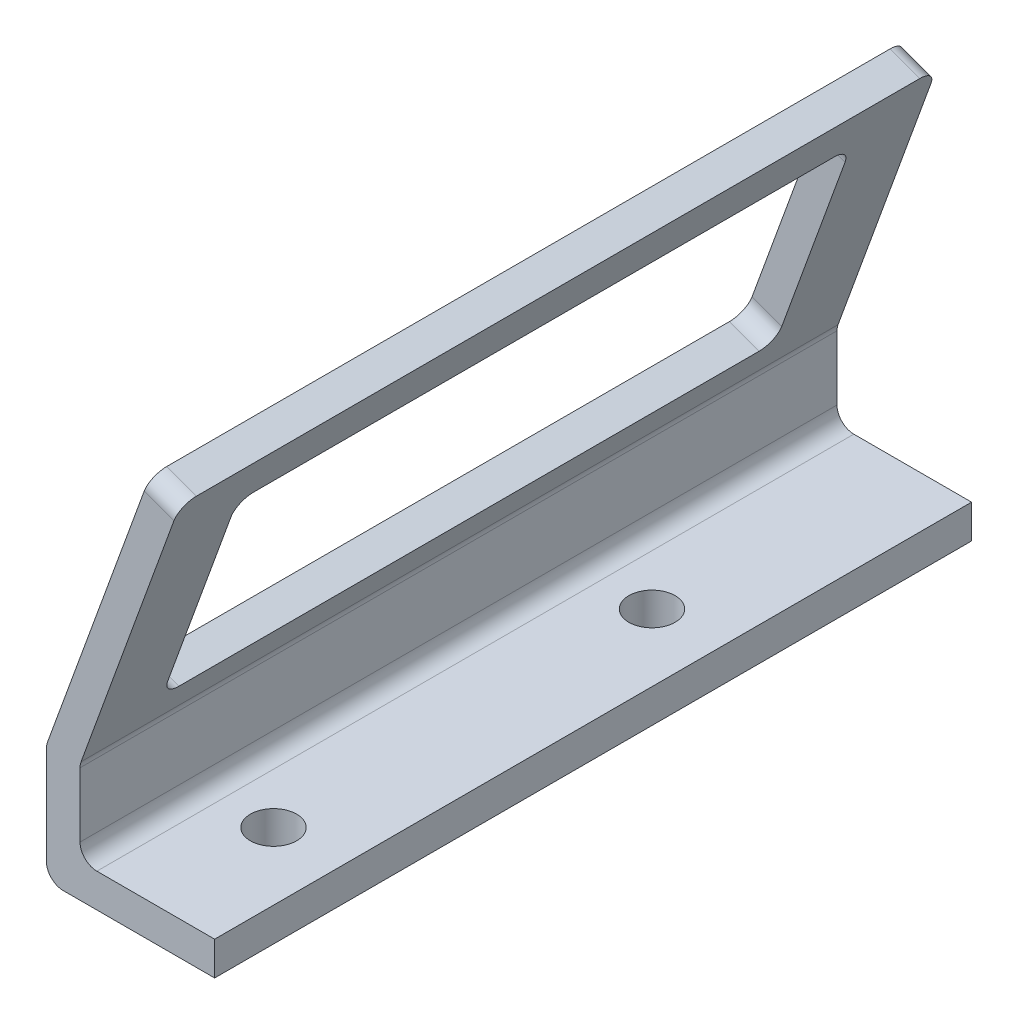
ISO-10303-21;
HEADER;
FILE_DESCRIPTION(('STEP AP214'),'2;1');
FILE_NAME('part.step','',(''),(''),'','','');
FILE_SCHEMA(('AUTOMOTIVE_DESIGN { 1 0 10303 214 1 1 1 1 }'));
ENDSEC;
DATA;
#1=APPLICATION_CONTEXT('core data for automotive mechanical design processes');
#2=APPLICATION_PROTOCOL_DEFINITION('international standard','automotive_design',2000,#1);
#3=PRODUCT_CONTEXT('',#1,'mechanical');
#4=PRODUCT('Part','Part','',(#3));
#5=PRODUCT_RELATED_PRODUCT_CATEGORY('part','',(#4));
#6=PRODUCT_DEFINITION_FORMATION('','',#4);
#7=PRODUCT_DEFINITION_CONTEXT('part definition',#1,'design');
#8=PRODUCT_DEFINITION('design','',#6,#7);
#9=PRODUCT_DEFINITION_SHAPE('','',#8);
#10=(LENGTH_UNIT() NAMED_UNIT(*) SI_UNIT(.MILLI.,.METRE.));
#11=(NAMED_UNIT(*) PLANE_ANGLE_UNIT() SI_UNIT($,.RADIAN.));
#12=(NAMED_UNIT(*) SI_UNIT($,.STERADIAN.) SOLID_ANGLE_UNIT());
#13=UNCERTAINTY_MEASURE_WITH_UNIT(LENGTH_MEASURE(1.E-05),#10,'distance_accuracy_value','');
#14=(GEOMETRIC_REPRESENTATION_CONTEXT(3) GLOBAL_UNCERTAINTY_ASSIGNED_CONTEXT((#13)) GLOBAL_UNIT_ASSIGNED_CONTEXT((#10,
#11,#12)) REPRESENTATION_CONTEXT('',''));
#15=CARTESIAN_POINT('',(0.,0.,0.));
#16=DIRECTION('',(0.,0.,1.));
#17=DIRECTION('',(1.,0.,0.));
#18=AXIS2_PLACEMENT_3D('',#15,#16,#17);
#19=CARTESIAN_POINT('',(-9.15485898747614,3.33209617034567,45.));
#20=DIRECTION('',(0.93969262078591,-0.342020143325663,0.));
#21=DIRECTION('',(0.342020143325663,0.939692620785911,0.));
#22=AXIS2_PLACEMENT_3D('',#19,#20,#21);
#23=PLANE('',#22);
#24=DIRECTION('',(-0.342020143325663,-0.939692620785911,0.));
#25=VECTOR('',#24,1.);
#26=CARTESIAN_POINT('',(-9.15485898747614,3.33209617034568,36.5));
#27=LINE('',#26,#25);
#28=CARTESIAN_POINT('',(3.4506730426822,37.9655107834184,36.5));
#29=VERTEX_POINT('',#28);
#30=CARTESIAN_POINT('',(-4.07377011048238,17.2922731261283,36.5));
#31=VERTEX_POINT('',#30);
#32=EDGE_CURVE('E229',#29,#31,#27,.T.);
#33=ORIENTED_EDGE('',*,*,#32,.F.);
#34=CARTESIAN_POINT('',(3.4506730426822,37.9655107834184,34.5));
#35=DIRECTION('',(0.93969262078591,-0.342020143325663,0.));
#36=DIRECTION('',(0.342020143325663,0.939692620785911,0.));
#37=AXIS2_PLACEMENT_3D('',#34,#35,#36);
#38=CIRCLE('',#37,2.);
#39=CARTESIAN_POINT('',(4.13471332933353,39.8448960249902,34.5));
#40=VERTEX_POINT('',#39);
#41=EDGE_CURVE('E320',#29,#40,#38,.F.);
#42=ORIENTED_EDGE('',*,*,#41,.T.);
#43=DIRECTION('',(0.,0.,1.));
#44=VECTOR('',#43,1.);
#45=CARTESIAN_POINT('',(4.13471332933353,39.8448960249902,45.));
#46=LINE('',#45,#44);
#47=CARTESIAN_POINT('',(4.13471332933353,39.8448960249902,-34.5));
#48=VERTEX_POINT('',#47);
#49=EDGE_CURVE('E356',#48,#40,#46,.T.);
#50=ORIENTED_EDGE('',*,*,#49,.F.);
#51=CARTESIAN_POINT('',(3.4506730426822,37.9655107834184,-34.5));
#52=DIRECTION('',(0.93969262078591,-0.342020143325663,0.));
#53=DIRECTION('',(0.342020143325663,0.939692620785911,0.));
#54=AXIS2_PLACEMENT_3D('',#51,#52,#53);
#55=CIRCLE('',#54,2.);
#56=CARTESIAN_POINT('',(3.45067304268221,37.9655107834184,-36.5));
#57=VERTEX_POINT('',#56);
#58=EDGE_CURVE('E11',#48,#57,#55,.F.);
#59=ORIENTED_EDGE('',*,*,#58,.T.);
#60=DIRECTION('',(0.342020143325663,0.939692620785911,0.));
#61=VECTOR('',#60,1.);
#62=CARTESIAN_POINT('',(-9.15485898747614,3.33209617034567,-36.5));
#63=LINE('',#62,#61);
#64=CARTESIAN_POINT('',(-4.07377011048238,17.2922731261283,-36.5));
#65=VERTEX_POINT('',#64);
#66=EDGE_CURVE('E354',#65,#57,#63,.T.);
#67=ORIENTED_EDGE('',*,*,#66,.F.);
#68=CARTESIAN_POINT('',(-4.07377011048239,17.2922731261283,-34.5));
#69=DIRECTION('',(0.93969262078591,-0.342020143325663,0.));
#70=DIRECTION('',(0.342020143325663,0.939692620785911,0.));
#71=AXIS2_PLACEMENT_3D('',#68,#69,#70);
#72=CIRCLE('',#71,2.);
#73=CARTESIAN_POINT('',(-4.75781039713371,15.4128878845565,-34.5));
#74=VERTEX_POINT('',#73);
#75=EDGE_CURVE('E328',#65,#74,#72,.F.);
#76=ORIENTED_EDGE('',*,*,#75,.T.);
#77=DIRECTION('',(0.,0.,-1.));
#78=VECTOR('',#77,1.);
#79=CARTESIAN_POINT('',(-4.75781039713371,15.4128878845565,45.));
#80=LINE('',#79,#78);
#81=CARTESIAN_POINT('',(-4.75781039713371,15.4128878845565,34.5));
#82=VERTEX_POINT('',#81);
#83=EDGE_CURVE('E360',#82,#74,#80,.T.);
#84=ORIENTED_EDGE('',*,*,#83,.F.);
#85=CARTESIAN_POINT('',(-4.07377011048238,17.2922731261283,34.5));
#86=DIRECTION('',(0.93969262078591,-0.342020143325663,0.));
#87=DIRECTION('',(0.342020143325663,0.939692620785911,0.));
#88=AXIS2_PLACEMENT_3D('',#85,#86,#87);
#89=CIRCLE('',#88,2.);
#90=EDGE_CURVE('E324',#82,#31,#89,.F.);
#91=ORIENTED_EDGE('',*,*,#90,.T.);
#92=EDGE_LOOP('',(#33,#42,#50,#59,#67,#76,#84,#91));
#93=FACE_BOUND('',#92,.T.);
#94=DIRECTION('',(-0.342020143325663,-0.939692620785911,0.));
#95=VECTOR('',#94,1.);
#96=CARTESIAN_POINT('',(-9.15485898747614,3.33209617034567,45.));
#97=LINE('',#96,#95);
#98=CARTESIAN_POINT('',(5.16077375931052,42.6639738873479,45.));
#99=VERTEX_POINT('',#98);
#100=CARTESIAN_POINT('',(-5.87938524157182,12.3313863252344,45.));
#101=VERTEX_POINT('',#100);
#102=EDGE_CURVE('E243',#99,#101,#97,.T.);
#103=ORIENTED_EDGE('',*,*,#102,.T.);
#104=DIRECTION('',(0.,0.,-1.));
#105=VECTOR('',#104,1.);
#106=CARTESIAN_POINT('',(-5.87938524157182,12.3313863252344,45.));
#107=LINE('',#106,#105);
#108=CARTESIAN_POINT('',(-5.87938524157182,12.3313863252344,-45.));
#109=VERTEX_POINT('',#108);
#110=EDGE_CURVE('E278',#101,#109,#107,.T.);
#111=ORIENTED_EDGE('',*,*,#110,.T.);
#112=DIRECTION('',(-0.342020143325663,-0.939692620785911,0.));
#113=VECTOR('',#112,1.);
#114=CARTESIAN_POINT('',(-9.15485898747614,3.33209617034567,-45.));
#115=LINE('',#114,#113);
#116=CARTESIAN_POINT('',(5.16077375931052,42.6639738873479,-45.));
#117=VERTEX_POINT('',#116);
#118=EDGE_CURVE('E225',#117,#109,#115,.T.);
#119=ORIENTED_EDGE('',*,*,#118,.F.);
#120=CARTESIAN_POINT('',(5.16077375931052,42.6639738873479,-43.));
#121=DIRECTION('',(0.93969262078591,-0.342020143325663,0.));
#122=DIRECTION('',(0.342020143325663,0.939692620785911,0.));
#123=AXIS2_PLACEMENT_3D('',#120,#121,#122);
#124=CIRCLE('',#123,2.);
#125=CARTESIAN_POINT('',(5.84481404596184,44.5433591289197,-43.));
#126=VERTEX_POINT('',#125);
#127=EDGE_CURVE('E274',#117,#126,#124,.T.);
#128=ORIENTED_EDGE('',*,*,#127,.T.);
#129=DIRECTION('',(0.,0.,-1.));
#130=VECTOR('',#129,1.);
#131=CARTESIAN_POINT('',(5.84481404596184,44.5433591289197,45.));
#132=LINE('',#131,#130);
#133=CARTESIAN_POINT('',(5.84481404596184,44.5433591289197,43.));
#134=VERTEX_POINT('',#133);
#135=EDGE_CURVE('E246',#134,#126,#132,.T.);
#136=ORIENTED_EDGE('',*,*,#135,.F.);
#137=CARTESIAN_POINT('',(5.16077375931052,42.6639738873479,43.));
#138=DIRECTION('',(0.93969262078591,-0.342020143325663,0.));
#139=DIRECTION('',(0.342020143325663,0.939692620785911,0.));
#140=AXIS2_PLACEMENT_3D('',#137,#138,#139);
#141=CIRCLE('',#140,2.);
#142=EDGE_CURVE('E276',#134,#99,#141,.T.);
#143=ORIENTED_EDGE('',*,*,#142,.T.);
#144=EDGE_LOOP('',(#103,#111,#119,#128,#136,#143));
#145=FACE_BOUND('',#144,.T.);
#146=ADVANCED_FACE('F39',(#93,#145),#23,.T.);
#147=CARTESIAN_POINT('',(14.9996730334379,41.2112629585741,45.));
#148=DIRECTION('',(0.342020143325661,0.939692620785911,0.));
#149=DIRECTION('',(-0.939692620785911,0.342020143325661,0.));
#150=AXIS2_PLACEMENT_3D('',#147,#148,#149);
#151=PLANE('',#150);
#152=DIRECTION('',(0.,0.,-1.));
#153=VECTOR('',#152,1.);
#154=CARTESIAN_POINT('',(2.31272515972385,45.8289343482928,45.));
#155=LINE('',#154,#153);
#156=CARTESIAN_POINT('',(2.31272515972385,45.8289343482928,43.));
#157=VERTEX_POINT('',#156);
#158=CARTESIAN_POINT('',(2.31272515972385,45.8289343482928,-43.));
#159=VERTEX_POINT('',#158);
#160=EDGE_CURVE('E211',#157,#159,#155,.T.);
#161=ORIENTED_EDGE('',*,*,#160,.F.);
#162=DIRECTION('',(0.939692620785911,-0.342020143325661,0.));
#163=VECTOR('',#162,1.);
#164=CARTESIAN_POINT('',(14.9996730334379,41.2112629585741,43.));
#165=LINE('',#164,#163);
#166=EDGE_CURVE('E287',#157,#134,#165,.T.);
#167=ORIENTED_EDGE('',*,*,#166,.T.);
#168=ORIENTED_EDGE('',*,*,#135,.T.);
#169=DIRECTION('',(0.939692620785911,-0.342020143325661,0.));
#170=VECTOR('',#169,1.);
#171=CARTESIAN_POINT('',(2.31272515972385,45.8289343482928,-43.));
#172=LINE('',#171,#170);
#173=EDGE_CURVE('E54',#126,#159,#172,.F.);
#174=ORIENTED_EDGE('',*,*,#173,.T.);
#175=EDGE_LOOP('',(#161,#167,#168,#174));
#176=FACE_BOUND('',#175,.T.);
#177=ADVANCED_FACE('F423',(#176),#151,.T.);
#178=CARTESIAN_POINT('',(-12.6869478737141,4.61767138971873,45.));
#179=DIRECTION('',(-0.939692620785911,0.342020143325662,0.));
#180=DIRECTION('',(-0.342020143325662,-0.939692620785911,0.));
#181=AXIS2_PLACEMENT_3D('',#178,#179,#180);
#182=PLANE('',#181);
#183=DIRECTION('',(0.342020143325662,0.939692620785911,0.));
#184=VECTOR('',#183,1.);
#185=CARTESIAN_POINT('',(0.602624443095541,41.1304712443632,36.5));
#186=LINE('',#185,#184);
#187=CARTESIAN_POINT('',(-7.60585899672036,18.5778483455014,36.5));
#188=VERTEX_POINT('',#187);
#189=CARTESIAN_POINT('',(-0.0814158435557841,39.2510860027914,36.5));
#190=VERTEX_POINT('',#189);
#191=EDGE_CURVE('E346',#188,#190,#186,.T.);
#192=ORIENTED_EDGE('',*,*,#191,.F.);
#193=CARTESIAN_POINT('',(-7.60585899672036,18.5778483455014,34.5));
#194=DIRECTION('',(-0.939692620785911,0.342020143325662,0.));
#195=DIRECTION('',(-0.342020143325662,-0.939692620785911,0.));
#196=AXIS2_PLACEMENT_3D('',#193,#194,#195);
#197=CIRCLE('',#196,2.);
#198=CARTESIAN_POINT('',(-8.28989928337168,16.6984631039296,34.5));
#199=VERTEX_POINT('',#198);
#200=EDGE_CURVE('E322',#188,#199,#197,.F.);
#201=ORIENTED_EDGE('',*,*,#200,.T.);
#202=DIRECTION('',(0.,0.,1.));
#203=VECTOR('',#202,1.);
#204=CARTESIAN_POINT('',(-8.28989928337168,16.6984631039296,-36.5));
#205=LINE('',#204,#203);
#206=CARTESIAN_POINT('',(-8.28989928337168,16.6984631039296,-34.5));
#207=VERTEX_POINT('',#206);
#208=EDGE_CURVE('E364',#207,#199,#205,.T.);
#209=ORIENTED_EDGE('',*,*,#208,.F.);
#210=CARTESIAN_POINT('',(-7.60585899672036,18.5778483455014,-34.5));
#211=DIRECTION('',(-0.939692620785911,0.342020143325662,0.));
#212=DIRECTION('',(-0.342020143325662,-0.939692620785911,0.));
#213=AXIS2_PLACEMENT_3D('',#210,#211,#212);
#214=CIRCLE('',#213,2.);
#215=CARTESIAN_POINT('',(-7.60585899672036,18.5778483455014,-36.5));
#216=VERTEX_POINT('',#215);
#217=EDGE_CURVE('E326',#207,#216,#214,.F.);
#218=ORIENTED_EDGE('',*,*,#217,.T.);
#219=DIRECTION('',(-0.342020143325662,-0.939692620785911,0.));
#220=VECTOR('',#219,1.);
#221=CARTESIAN_POINT('',(0.602624443095542,41.1304712443632,-36.5));
#222=LINE('',#221,#220);
#223=CARTESIAN_POINT('',(-0.0814158435557827,39.2510860027914,-36.5));
#224=VERTEX_POINT('',#223);
#225=EDGE_CURVE('E337',#224,#216,#222,.T.);
#226=ORIENTED_EDGE('',*,*,#225,.F.);
#227=CARTESIAN_POINT('',(-0.0814158435557821,39.2510860027914,-34.5));
#228=DIRECTION('',(-0.939692620785911,0.342020143325662,0.));
#229=DIRECTION('',(-0.342020143325662,-0.939692620785911,0.));
#230=AXIS2_PLACEMENT_3D('',#227,#228,#229);
#231=CIRCLE('',#230,2.);
#232=CARTESIAN_POINT('',(0.602624443095542,41.1304712443632,-34.5));
#233=VERTEX_POINT('',#232);
#234=EDGE_CURVE('E47',#224,#233,#231,.F.);
#235=ORIENTED_EDGE('',*,*,#234,.T.);
#236=DIRECTION('',(0.,0.,-1.));
#237=VECTOR('',#236,1.);
#238=CARTESIAN_POINT('',(0.602624443095542,41.1304712443632,-36.5));
#239=LINE('',#238,#237);
#240=CARTESIAN_POINT('',(0.602624443095541,41.1304712443632,34.5));
#241=VERTEX_POINT('',#240);
#242=EDGE_CURVE('E335',#241,#233,#239,.T.);
#243=ORIENTED_EDGE('',*,*,#242,.F.);
#244=CARTESIAN_POINT('',(-0.0814158435557856,39.2510860027914,34.5));
#245=DIRECTION('',(-0.939692620785911,0.342020143325662,0.));
#246=DIRECTION('',(-0.342020143325662,-0.939692620785911,0.));
#247=AXIS2_PLACEMENT_3D('',#244,#245,#246);
#248=CIRCLE('',#247,2.);
#249=EDGE_CURVE('E318',#241,#190,#248,.F.);
#250=ORIENTED_EDGE('',*,*,#249,.T.);
#251=EDGE_LOOP('',(#192,#201,#209,#218,#226,#235,#243,#250));
#252=FACE_BOUND('',#251,.T.);
#253=DIRECTION('',(0.342020143325662,0.939692620785911,0.));
#254=VECTOR('',#253,1.);
#255=CARTESIAN_POINT('',(-12.6869478737141,4.61767138971873,-45.));
#256=LINE('',#255,#254);
#257=CARTESIAN_POINT('',(-9.87938524157182,12.3313863252344,-45.));
#258=VERTEX_POINT('',#257);
#259=CARTESIAN_POINT('',(1.62868487307252,43.949549106721,-45.));
#260=VERTEX_POINT('',#259);
#261=EDGE_CURVE('E228',#258,#260,#256,.T.);
#262=ORIENTED_EDGE('',*,*,#261,.F.);
#263=DIRECTION('',(0.,0.,-1.));
#264=VECTOR('',#263,1.);
#265=CARTESIAN_POINT('',(-9.87938524157182,12.3313863252344,45.));
#266=LINE('',#265,#264);
#267=CARTESIAN_POINT('',(-9.87938524157182,12.3313863252344,45.));
#268=VERTEX_POINT('',#267);
#269=EDGE_CURVE('E284',#258,#268,#266,.F.);
#270=ORIENTED_EDGE('',*,*,#269,.T.);
#271=DIRECTION('',(0.342020143325662,0.939692620785911,0.));
#272=VECTOR('',#271,1.);
#273=CARTESIAN_POINT('',(-12.6869478737141,4.61767138971873,45.));
#274=LINE('',#273,#272);
#275=CARTESIAN_POINT('',(1.62868487307252,43.949549106721,45.));
#276=VERTEX_POINT('',#275);
#277=EDGE_CURVE('E372',#268,#276,#274,.T.);
#278=ORIENTED_EDGE('',*,*,#277,.T.);
#279=CARTESIAN_POINT('',(1.62868487307253,43.949549106721,43.));
#280=DIRECTION('',(-0.939692620785911,0.342020143325662,0.));
#281=DIRECTION('',(-0.342020143325662,-0.939692620785911,0.));
#282=AXIS2_PLACEMENT_3D('',#279,#280,#281);
#283=CIRCLE('',#282,2.);
#284=EDGE_CURVE('E61',#276,#157,#283,.T.);
#285=ORIENTED_EDGE('',*,*,#284,.T.);
#286=ORIENTED_EDGE('',*,*,#160,.T.);
#287=CARTESIAN_POINT('',(1.62868487307252,43.949549106721,-43.));
#288=DIRECTION('',(-0.939692620785911,0.342020143325662,0.));
#289=DIRECTION('',(-0.342020143325662,-0.939692620785911,0.));
#290=AXIS2_PLACEMENT_3D('',#287,#288,#289);
#291=CIRCLE('',#290,2.);
#292=EDGE_CURVE('E281',#159,#260,#291,.T.);
#293=ORIENTED_EDGE('',*,*,#292,.T.);
#294=EDGE_LOOP('',(#262,#270,#278,#285,#286,#293));
#295=FACE_BOUND('',#294,.T.);
#296=ADVANCED_FACE('F334',(#252,#295),#182,.T.);
#297=CARTESIAN_POINT('',(-10.,0.,45.));
#298=DIRECTION('',(-1.,0.,0.));
#299=DIRECTION('',(0.,0.,1.));
#300=AXIS2_PLACEMENT_3D('',#297,#298,#299);
#301=PLANE('',#300);
#302=DIRECTION('',(0.,1.,0.));
#303=VECTOR('',#302,1.);
#304=CARTESIAN_POINT('',(-10.,0.,-45.));
#305=LINE('',#304,#303);
#306=CARTESIAN_POINT('',(-10.,0.,-45.));
#307=VERTEX_POINT('',#306);
#308=CARTESIAN_POINT('',(-10.,11.6473460385831,-45.));
#309=VERTEX_POINT('',#308);
#310=EDGE_CURVE('E232',#307,#309,#305,.T.);
#311=ORIENTED_EDGE('',*,*,#310,.F.);
#312=DIRECTION('',(0.,0.,-1.));
#313=VECTOR('',#312,1.);
#314=CARTESIAN_POINT('',(-10.,0.,45.));
#315=LINE('',#314,#313);
#316=CARTESIAN_POINT('',(-10.,0.,45.));
#317=VERTEX_POINT('',#316);
#318=EDGE_CURVE('E260',#307,#317,#315,.F.);
#319=ORIENTED_EDGE('',*,*,#318,.T.);
#320=DIRECTION('',(0.,1.,0.));
#321=VECTOR('',#320,1.);
#322=CARTESIAN_POINT('',(-10.,0.,45.));
#323=LINE('',#322,#321);
#324=CARTESIAN_POINT('',(-10.,11.6473460385831,45.));
#325=VERTEX_POINT('',#324);
#326=EDGE_CURVE('E201',#317,#325,#323,.T.);
#327=ORIENTED_EDGE('',*,*,#326,.T.);
#328=DIRECTION('',(0.,0.,-1.));
#329=VECTOR('',#328,1.);
#330=CARTESIAN_POINT('',(-10.,11.6473460385831,45.));
#331=LINE('',#330,#329);
#332=EDGE_CURVE('E257',#325,#309,#331,.T.);
#333=ORIENTED_EDGE('',*,*,#332,.T.);
#334=EDGE_LOOP('',(#311,#319,#327,#333));
#335=FACE_BOUND('',#334,.T.);
#336=ADVANCED_FACE('F377',(#335),#301,.T.);
#337=CARTESIAN_POINT('',(0.,-2.,45.));
#338=DIRECTION('',(0.,1.,0.));
#339=DIRECTION('',(0.,0.,1.));
#340=AXIS2_PLACEMENT_3D('',#337,#338,#339);
#341=PLANE('',#340);
#342=CARTESIAN_POINT('',(2.,-2.,30.));
#343=DIRECTION('',(0.,1.,0.));
#344=DIRECTION('',(0.,0.,1.));
#345=AXIS2_PLACEMENT_3D('',#342,#343,#344);
#346=CIRCLE('',#345,2.75);
#347=CARTESIAN_POINT('',(2.,-2.,32.75));
#348=VERTEX_POINT('',#347);
#349=EDGE_CURVE('E472',#348,#348,#346,.T.);
#350=ORIENTED_EDGE('',*,*,#349,.T.);
#351=EDGE_LOOP('',(#350));
#352=FACE_BOUND('',#351,.T.);
#353=CARTESIAN_POINT('',(2.,-2.,-15.));
#354=DIRECTION('',(0.,1.,0.));
#355=DIRECTION('',(0.,0.,1.));
#356=AXIS2_PLACEMENT_3D('',#353,#354,#355);
#357=CIRCLE('',#356,2.75);
#358=CARTESIAN_POINT('',(2.,-2.,-12.25));
#359=VERTEX_POINT('',#358);
#360=EDGE_CURVE('E473',#359,#359,#357,.T.);
#361=ORIENTED_EDGE('',*,*,#360,.T.);
#362=EDGE_LOOP('',(#361));
#363=FACE_BOUND('',#362,.T.);
#364=DIRECTION('',(1.,0.,0.));
#365=VECTOR('',#364,1.);
#366=CARTESIAN_POINT('',(0.,-2.,45.));
#367=LINE('',#366,#365);
#368=CARTESIAN_POINT('',(-8.,-2.,45.));
#369=VERTEX_POINT('',#368);
#370=CARTESIAN_POINT('',(10.,-2.,45.));
#371=VERTEX_POINT('',#370);
#372=EDGE_CURVE('E189',#369,#371,#367,.T.);
#373=ORIENTED_EDGE('',*,*,#372,.F.);
#374=DIRECTION('',(0.,0.,-1.));
#375=VECTOR('',#374,1.);
#376=CARTESIAN_POINT('',(-8.,-2.,-45.));
#377=LINE('',#376,#375);
#378=CARTESIAN_POINT('',(-8.,-2.,-45.));
#379=VERTEX_POINT('',#378);
#380=EDGE_CURVE('E248',#369,#379,#377,.T.);
#381=ORIENTED_EDGE('',*,*,#380,.T.);
#382=DIRECTION('',(1.,0.,0.));
#383=VECTOR('',#382,1.);
#384=CARTESIAN_POINT('',(0.,-2.,-45.));
#385=LINE('',#384,#383);
#386=CARTESIAN_POINT('',(10.,-2.,-45.));
#387=VERTEX_POINT('',#386);
#388=EDGE_CURVE('E207',#379,#387,#385,.T.);
#389=ORIENTED_EDGE('',*,*,#388,.T.);
#390=DIRECTION('',(0.,0.,-1.));
#391=VECTOR('',#390,1.);
#392=CARTESIAN_POINT('',(10.,-2.,45.));
#393=LINE('',#392,#391);
#394=EDGE_CURVE('E204',#371,#387,#393,.T.);
#395=ORIENTED_EDGE('',*,*,#394,.F.);
#396=EDGE_LOOP('',(#373,#381,#389,#395));
#397=FACE_BOUND('',#396,.T.);
#398=ADVANCED_FACE('F205',(#352,#363,#397),#341,.F.);
#399=CARTESIAN_POINT('',(10.,0.,45.));
#400=DIRECTION('',(1.,0.,0.));
#401=DIRECTION('',(0.,0.,-1.));
#402=AXIS2_PLACEMENT_3D('',#399,#400,#401);
#403=PLANE('',#402);
#404=DIRECTION('',(0.,-1.,0.));
#405=VECTOR('',#404,1.);
#406=CARTESIAN_POINT('',(10.,0.,-45.));
#407=LINE('',#406,#405);
#408=CARTESIAN_POINT('',(10.,2.,-45.));
#409=VERTEX_POINT('',#408);
#410=EDGE_CURVE('E236',#409,#387,#407,.T.);
#411=ORIENTED_EDGE('',*,*,#410,.F.);
#412=DIRECTION('',(0.,0.,-1.));
#413=VECTOR('',#412,1.);
#414=CARTESIAN_POINT('',(10.,2.,45.));
#415=LINE('',#414,#413);
#416=CARTESIAN_POINT('',(10.,2.,45.));
#417=VERTEX_POINT('',#416);
#418=EDGE_CURVE('E212',#417,#409,#415,.T.);
#419=ORIENTED_EDGE('',*,*,#418,.F.);
#420=DIRECTION('',(0.,-1.,0.));
#421=VECTOR('',#420,1.);
#422=CARTESIAN_POINT('',(10.,0.,45.));
#423=LINE('',#422,#421);
#424=EDGE_CURVE('E195',#417,#371,#423,.T.);
#425=ORIENTED_EDGE('',*,*,#424,.T.);
#426=ORIENTED_EDGE('',*,*,#394,.T.);
#427=EDGE_LOOP('',(#411,#419,#425,#426));
#428=FACE_BOUND('',#427,.T.);
#429=ADVANCED_FACE('F215',(#428),#403,.T.);
#430=CARTESIAN_POINT('',(0.,2.,45.));
#431=DIRECTION('',(0.,1.,0.));
#432=DIRECTION('',(0.,0.,1.));
#433=AXIS2_PLACEMENT_3D('',#430,#431,#432);
#434=PLANE('',#433);
#435=CARTESIAN_POINT('',(2.,2.,30.));
#436=DIRECTION('',(0.,1.,0.));
#437=DIRECTION('',(0.,0.,1.));
#438=AXIS2_PLACEMENT_3D('',#435,#436,#437);
#439=CIRCLE('',#438,2.75);
#440=CARTESIAN_POINT('',(2.,2.,32.75));
#441=VERTEX_POINT('',#440);
#442=EDGE_CURVE('E469',#441,#441,#439,.T.);
#443=ORIENTED_EDGE('',*,*,#442,.F.);
#444=EDGE_LOOP('',(#443));
#445=FACE_BOUND('',#444,.T.);
#446=CARTESIAN_POINT('',(2.,2.,-15.));
#447=DIRECTION('',(0.,1.,0.));
#448=DIRECTION('',(0.,0.,1.));
#449=AXIS2_PLACEMENT_3D('',#446,#447,#448);
#450=CIRCLE('',#449,2.75);
#451=CARTESIAN_POINT('',(2.,2.,-12.25));
#452=VERTEX_POINT('',#451);
#453=EDGE_CURVE('E734',#452,#452,#450,.T.);
#454=ORIENTED_EDGE('',*,*,#453,.F.);
#455=EDGE_LOOP('',(#454));
#456=FACE_BOUND('',#455,.T.);
#457=DIRECTION('',(1.,0.,0.));
#458=VECTOR('',#457,1.);
#459=CARTESIAN_POINT('',(0.,2.,-45.));
#460=LINE('',#459,#458);
#461=CARTESIAN_POINT('',(-4.,2.,-45.));
#462=VERTEX_POINT('',#461);
#463=EDGE_CURVE('E238',#462,#409,#460,.T.);
#464=ORIENTED_EDGE('',*,*,#463,.F.);
#465=DIRECTION('',(0.,0.,-1.));
#466=VECTOR('',#465,1.);
#467=CARTESIAN_POINT('',(-4.,2.,45.));
#468=LINE('',#467,#466);
#469=CARTESIAN_POINT('',(-4.,2.,45.));
#470=VERTEX_POINT('',#469);
#471=EDGE_CURVE('E272',#462,#470,#468,.F.);
#472=ORIENTED_EDGE('',*,*,#471,.T.);
#473=DIRECTION('',(1.,0.,0.));
#474=VECTOR('',#473,1.);
#475=CARTESIAN_POINT('',(0.,2.,45.));
#476=LINE('',#475,#474);
#477=EDGE_CURVE('E217',#470,#417,#476,.T.);
#478=ORIENTED_EDGE('',*,*,#477,.T.);
#479=ORIENTED_EDGE('',*,*,#418,.T.);
#480=EDGE_LOOP('',(#464,#472,#478,#479));
#481=FACE_BOUND('',#480,.T.);
#482=ADVANCED_FACE('F410',(#445,#456,#481),#434,.T.);
#483=CARTESIAN_POINT('',(-6.,0.,45.));
#484=DIRECTION('',(-1.,0.,0.));
#485=DIRECTION('',(0.,0.,1.));
#486=AXIS2_PLACEMENT_3D('',#483,#484,#485);
#487=PLANE('',#486);
#488=DIRECTION('',(0.,1.,0.));
#489=VECTOR('',#488,1.);
#490=CARTESIAN_POINT('',(-6.,0.,45.));
#491=LINE('',#490,#489);
#492=CARTESIAN_POINT('',(-6.,4.,45.));
#493=VERTEX_POINT('',#492);
#494=CARTESIAN_POINT('',(-6.,11.6473460385831,45.));
#495=VERTEX_POINT('',#494);
#496=EDGE_CURVE('E219',#493,#495,#491,.T.);
#497=ORIENTED_EDGE('',*,*,#496,.F.);
#498=DIRECTION('',(0.,0.,-1.));
#499=VECTOR('',#498,1.);
#500=CARTESIAN_POINT('',(-6.,4.,45.));
#501=LINE('',#500,#499);
#502=CARTESIAN_POINT('',(-6.,4.,-45.));
#503=VERTEX_POINT('',#502);
#504=EDGE_CURVE('E269',#493,#503,#501,.T.);
#505=ORIENTED_EDGE('',*,*,#504,.T.);
#506=DIRECTION('',(0.,1.,0.));
#507=VECTOR('',#506,1.);
#508=CARTESIAN_POINT('',(-6.,0.,-45.));
#509=LINE('',#508,#507);
#510=CARTESIAN_POINT('',(-6.,11.6473460385831,-45.));
#511=VERTEX_POINT('',#510);
#512=EDGE_CURVE('E240',#503,#511,#509,.T.);
#513=ORIENTED_EDGE('',*,*,#512,.T.);
#514=DIRECTION('',(0.,0.,-1.));
#515=VECTOR('',#514,1.);
#516=CARTESIAN_POINT('',(-6.,11.6473460385831,45.));
#517=LINE('',#516,#515);
#518=EDGE_CURVE('E267',#511,#495,#517,.F.);
#519=ORIENTED_EDGE('',*,*,#518,.T.);
#520=EDGE_LOOP('',(#497,#505,#513,#519));
#521=FACE_BOUND('',#520,.T.);
#522=ADVANCED_FACE('F402',(#521),#487,.F.);
#523=CARTESIAN_POINT('',(0.,0.,45.));
#524=DIRECTION('',(0.,0.,1.));
#525=DIRECTION('',(1.,0.,0.));
#526=AXIS2_PLACEMENT_3D('',#523,#524,#525);
#527=PLANE('',#526);
#528=ORIENTED_EDGE('',*,*,#326,.F.);
#529=CARTESIAN_POINT('',(-8.,0.,45.));
#530=DIRECTION('',(0.,0.,1.));
#531=DIRECTION('',(1.,0.,0.));
#532=AXIS2_PLACEMENT_3D('',#529,#530,#531);
#533=CIRCLE('',#532,2.);
#534=EDGE_CURVE('E197',#317,#369,#533,.T.);
#535=ORIENTED_EDGE('',*,*,#534,.T.);
#536=ORIENTED_EDGE('',*,*,#372,.T.);
#537=ORIENTED_EDGE('',*,*,#424,.F.);
#538=ORIENTED_EDGE('',*,*,#477,.F.);
#539=CARTESIAN_POINT('',(-4.,4.,45.));
#540=DIRECTION('',(0.,0.,1.));
#541=DIRECTION('',(1.,0.,0.));
#542=AXIS2_PLACEMENT_3D('',#539,#540,#541);
#543=CIRCLE('',#542,2.);
#544=EDGE_CURVE('E312',#470,#493,#543,.F.);
#545=ORIENTED_EDGE('',*,*,#544,.T.);
#546=ORIENTED_EDGE('',*,*,#496,.T.);
#547=CARTESIAN_POINT('',(-4.,11.6473460385831,45.));
#548=DIRECTION('',(0.,0.,1.));
#549=DIRECTION('',(1.,0.,0.));
#550=AXIS2_PLACEMENT_3D('',#547,#548,#549);
#551=CIRCLE('',#550,2.);
#552=EDGE_CURVE('E316',#495,#101,#551,.F.);
#553=ORIENTED_EDGE('',*,*,#552,.T.);
#554=ORIENTED_EDGE('',*,*,#102,.F.);
#555=DIRECTION('',(0.939692620785911,-0.342020143325661,0.));
#556=VECTOR('',#555,1.);
#557=CARTESIAN_POINT('',(14.3156327467866,39.3318777170023,45.));
#558=LINE('',#557,#556);
#559=EDGE_CURVE('E262',#99,#276,#558,.F.);
#560=ORIENTED_EDGE('',*,*,#559,.T.);
#561=ORIENTED_EDGE('',*,*,#277,.F.);
#562=CARTESIAN_POINT('',(-8.,11.6473460385831,45.));
#563=DIRECTION('',(0.,0.,1.));
#564=DIRECTION('',(1.,0.,0.));
#565=AXIS2_PLACEMENT_3D('',#562,#563,#564);
#566=CIRCLE('',#565,2.);
#567=EDGE_CURVE('E264',#268,#325,#566,.T.);
#568=ORIENTED_EDGE('',*,*,#567,.T.);
#569=EDGE_LOOP('',(#528,#535,#536,#537,#538,#545,#546,#553,#554,#560,#561,#568));
#570=FACE_BOUND('',#569,.T.);
#571=ADVANCED_FACE('F192',(#570),#527,.T.);
#572=CARTESIAN_POINT('',(0.,0.,-45.));
#573=DIRECTION('',(0.,0.,1.));
#574=DIRECTION('',(1.,0.,0.));
#575=AXIS2_PLACEMENT_3D('',#572,#573,#574);
#576=PLANE('',#575);
#577=ORIENTED_EDGE('',*,*,#388,.F.);
#578=CARTESIAN_POINT('',(-8.,0.,-45.));
#579=DIRECTION('',(0.,0.,1.));
#580=DIRECTION('',(1.,0.,0.));
#581=AXIS2_PLACEMENT_3D('',#578,#579,#580);
#582=CIRCLE('',#581,2.);
#583=EDGE_CURVE('E255',#379,#307,#582,.F.);
#584=ORIENTED_EDGE('',*,*,#583,.T.);
#585=ORIENTED_EDGE('',*,*,#310,.T.);
#586=CARTESIAN_POINT('',(-8.,11.6473460385831,-45.));
#587=DIRECTION('',(0.,0.,1.));
#588=DIRECTION('',(1.,0.,0.));
#589=AXIS2_PLACEMENT_3D('',#586,#587,#588);
#590=CIRCLE('',#589,2.);
#591=EDGE_CURVE('E253',#309,#258,#590,.F.);
#592=ORIENTED_EDGE('',*,*,#591,.T.);
#593=ORIENTED_EDGE('',*,*,#261,.T.);
#594=DIRECTION('',(0.939692620785911,-0.342020143325661,0.));
#595=VECTOR('',#594,1.);
#596=CARTESIAN_POINT('',(5.16077375931052,42.6639738873479,-45.));
#597=LINE('',#596,#595);
#598=EDGE_CURVE('E250',#260,#117,#597,.T.);
#599=ORIENTED_EDGE('',*,*,#598,.T.);
#600=ORIENTED_EDGE('',*,*,#118,.T.);
#601=CARTESIAN_POINT('',(-4.,11.6473460385831,-45.));
#602=DIRECTION('',(0.,0.,1.));
#603=DIRECTION('',(1.,0.,0.));
#604=AXIS2_PLACEMENT_3D('',#601,#602,#603);
#605=CIRCLE('',#604,2.);
#606=EDGE_CURVE('E314',#109,#511,#605,.T.);
#607=ORIENTED_EDGE('',*,*,#606,.T.);
#608=ORIENTED_EDGE('',*,*,#512,.F.);
#609=CARTESIAN_POINT('',(-4.,4.,-45.));
#610=DIRECTION('',(0.,0.,1.));
#611=DIRECTION('',(1.,0.,0.));
#612=AXIS2_PLACEMENT_3D('',#609,#610,#611);
#613=CIRCLE('',#612,2.);
#614=EDGE_CURVE('E310',#503,#462,#613,.T.);
#615=ORIENTED_EDGE('',*,*,#614,.T.);
#616=ORIENTED_EDGE('',*,*,#463,.T.);
#617=ORIENTED_EDGE('',*,*,#410,.T.);
#618=EDGE_LOOP('',(#577,#584,#585,#592,#593,#599,#600,#607,#608,#615,#616,#617));
#619=FACE_BOUND('',#618,.T.);
#620=ADVANCED_FACE('F385',(#619),#576,.F.);
#621=CARTESIAN_POINT('',(5.30108754702509,39.4203705277349,36.5));
#622=DIRECTION('',(0.,0.,1.));
#623=DIRECTION('',(0.,-1.,0.));
#624=AXIS2_PLACEMENT_3D('',#621,#622,#623);
#625=PLANE('',#624);
#626=ORIENTED_EDGE('',*,*,#191,.T.);
#627=DIRECTION('',(-0.939692620785911,0.342020143325662,0.));
#628=VECTOR('',#627,1.);
#629=CARTESIAN_POINT('',(3.4506730426822,37.9655107834184,36.5));
#630=LINE('',#629,#628);
#631=EDGE_CURVE('E298',#190,#29,#630,.F.);
#632=ORIENTED_EDGE('',*,*,#631,.T.);
#633=ORIENTED_EDGE('',*,*,#32,.T.);
#634=DIRECTION('',(-0.939692620785911,0.342020143325662,0.));
#635=VECTOR('',#634,1.);
#636=CARTESIAN_POINT('',(-7.60585899672036,18.5778483455014,36.5));
#637=LINE('',#636,#635);
#638=EDGE_CURVE('E295',#31,#188,#637,.T.);
#639=ORIENTED_EDGE('',*,*,#638,.T.);
#640=EDGE_LOOP('',(#626,#632,#633,#639));
#641=FACE_BOUND('',#640,.T.);
#642=ADVANCED_FACE('F445',(#641),#625,.F.);
#643=CARTESIAN_POINT('',(-3.59143617944213,14.9883623873012,-36.5));
#644=DIRECTION('',(-0.342020143325662,-0.939692620785911,0.));
#645=DIRECTION('',(0.939692620785911,-0.342020143325662,0.));
#646=AXIS2_PLACEMENT_3D('',#643,#644,#645);
#647=PLANE('',#646);
#648=ORIENTED_EDGE('',*,*,#208,.T.);
#649=DIRECTION('',(-0.939692620785911,0.342020143325662,0.));
#650=VECTOR('',#649,1.);
#651=CARTESIAN_POINT('',(-4.75781039713371,15.4128878845565,34.5));
#652=LINE('',#651,#650);
#653=EDGE_CURVE('E303',#199,#82,#652,.F.);
#654=ORIENTED_EDGE('',*,*,#653,.T.);
#655=ORIENTED_EDGE('',*,*,#83,.T.);
#656=DIRECTION('',(-0.939692620785911,0.342020143325662,0.));
#657=VECTOR('',#656,1.);
#658=CARTESIAN_POINT('',(-8.28989928337168,16.6984631039296,-34.5));
#659=LINE('',#658,#657);
#660=EDGE_CURVE('E300',#74,#207,#659,.T.);
#661=ORIENTED_EDGE('',*,*,#660,.T.);
#662=EDGE_LOOP('',(#648,#654,#655,#661));
#663=FACE_BOUND('',#662,.T.);
#664=ADVANCED_FACE('F449',(#663),#647,.F.);
#665=CARTESIAN_POINT('',(5.3010875470251,39.4203705277349,-36.5));
#666=DIRECTION('',(0.,0.,-1.));
#667=DIRECTION('',(-1.,0.,0.));
#668=AXIS2_PLACEMENT_3D('',#665,#666,#667);
#669=PLANE('',#668);
#670=ORIENTED_EDGE('',*,*,#225,.T.);
#671=DIRECTION('',(-0.939692620785911,0.342020143325662,0.));
#672=VECTOR('',#671,1.);
#673=CARTESIAN_POINT('',(-4.07377011048239,17.2922731261283,-36.5));
#674=LINE('',#673,#672);
#675=EDGE_CURVE('E308',#216,#65,#674,.F.);
#676=ORIENTED_EDGE('',*,*,#675,.T.);
#677=ORIENTED_EDGE('',*,*,#66,.T.);
#678=DIRECTION('',(-0.939692620785911,0.342020143325662,0.));
#679=VECTOR('',#678,1.);
#680=CARTESIAN_POINT('',(-0.0814158435557821,39.2510860027914,-36.5));
#681=LINE('',#680,#679);
#682=EDGE_CURVE('E305',#57,#224,#681,.T.);
#683=ORIENTED_EDGE('',*,*,#682,.T.);
#684=EDGE_LOOP('',(#670,#676,#677,#683));
#685=FACE_BOUND('',#684,.T.);
#686=ADVANCED_FACE('F358',(#685),#669,.F.);
#687=CARTESIAN_POINT('',(5.3010875470251,39.4203705277349,-36.5));
#688=DIRECTION('',(0.342020143325662,0.939692620785911,0.));
#689=DIRECTION('',(-0.939692620785911,0.342020143325662,0.));
#690=AXIS2_PLACEMENT_3D('',#687,#688,#689);
#691=PLANE('',#690);
#692=ORIENTED_EDGE('',*,*,#49,.T.);
#693=DIRECTION('',(-0.939692620785911,0.342020143325662,0.));
#694=VECTOR('',#693,1.);
#695=CARTESIAN_POINT('',(0.602624443095539,41.1304712443632,34.5));
#696=LINE('',#695,#694);
#697=EDGE_CURVE('E292',#40,#241,#696,.T.);
#698=ORIENTED_EDGE('',*,*,#697,.T.);
#699=ORIENTED_EDGE('',*,*,#242,.T.);
#700=DIRECTION('',(-0.939692620785911,0.342020143325662,0.));
#701=VECTOR('',#700,1.);
#702=CARTESIAN_POINT('',(4.13471332933353,39.8448960249902,-34.5));
#703=LINE('',#702,#701);
#704=EDGE_CURVE('E290',#233,#48,#703,.F.);
#705=ORIENTED_EDGE('',*,*,#704,.T.);
#706=EDGE_LOOP('',(#692,#698,#699,#705));
#707=FACE_BOUND('',#706,.T.);
#708=ADVANCED_FACE('F343',(#707),#691,.F.);
#709=CARTESIAN_POINT('',(-8.,0.,45.));
#710=DIRECTION('',(0.,0.,1.));
#711=DIRECTION('',(1.,0.,0.));
#712=AXIS2_PLACEMENT_3D('',#709,#710,#711);
#713=CYLINDRICAL_SURFACE('',#712,2.);
#714=ORIENTED_EDGE('',*,*,#534,.F.);
#715=ORIENTED_EDGE('',*,*,#318,.F.);
#716=ORIENTED_EDGE('',*,*,#583,.F.);
#717=ORIENTED_EDGE('',*,*,#380,.F.);
#718=EDGE_LOOP('',(#714,#715,#716,#717));
#719=FACE_BOUND('',#718,.T.);
#720=ADVANCED_FACE('F412',(#719),#713,.T.);
#721=CARTESIAN_POINT('',(-4.,4.,45.));
#722=DIRECTION('',(0.,0.,-1.));
#723=DIRECTION('',(-1.,0.,0.));
#724=AXIS2_PLACEMENT_3D('',#721,#722,#723);
#725=CYLINDRICAL_SURFACE('',#724,2.);
#726=ORIENTED_EDGE('',*,*,#544,.F.);
#727=ORIENTED_EDGE('',*,*,#471,.F.);
#728=ORIENTED_EDGE('',*,*,#614,.F.);
#729=ORIENTED_EDGE('',*,*,#504,.F.);
#730=EDGE_LOOP('',(#726,#727,#728,#729));
#731=FACE_BOUND('',#730,.T.);
#732=ADVANCED_FACE('F406',(#731),#725,.F.);
#733=CARTESIAN_POINT('',(-4.,11.6473460385831,45.));
#734=DIRECTION('',(0.,0.,-1.));
#735=DIRECTION('',(-1.,0.,0.));
#736=AXIS2_PLACEMENT_3D('',#733,#734,#735);
#737=CYLINDRICAL_SURFACE('',#736,2.);
#738=ORIENTED_EDGE('',*,*,#552,.F.);
#739=ORIENTED_EDGE('',*,*,#518,.F.);
#740=ORIENTED_EDGE('',*,*,#606,.F.);
#741=ORIENTED_EDGE('',*,*,#110,.F.);
#742=EDGE_LOOP('',(#738,#739,#740,#741));
#743=FACE_BOUND('',#742,.T.);
#744=ADVANCED_FACE('F397',(#743),#737,.F.);
#745=CARTESIAN_POINT('',(-8.,11.6473460385831,45.));
#746=DIRECTION('',(0.,0.,-1.));
#747=DIRECTION('',(-1.,0.,0.));
#748=AXIS2_PLACEMENT_3D('',#745,#746,#747);
#749=CYLINDRICAL_SURFACE('',#748,2.);
#750=ORIENTED_EDGE('',*,*,#567,.F.);
#751=ORIENTED_EDGE('',*,*,#269,.F.);
#752=ORIENTED_EDGE('',*,*,#591,.F.);
#753=ORIENTED_EDGE('',*,*,#332,.F.);
#754=EDGE_LOOP('',(#750,#751,#752,#753));
#755=FACE_BOUND('',#754,.T.);
#756=ADVANCED_FACE('F381',(#755),#749,.T.);
#757=CARTESIAN_POINT('',(14.3156327467866,39.3318777170023,43.));
#758=DIRECTION('',(0.939692620785911,-0.342020143325661,0.));
#759=DIRECTION('',(0.342020143325661,0.939692620785911,0.));
#760=AXIS2_PLACEMENT_3D('',#757,#758,#759);
#761=CYLINDRICAL_SURFACE('',#760,2.);
#762=ORIENTED_EDGE('',*,*,#284,.F.);
#763=ORIENTED_EDGE('',*,*,#559,.F.);
#764=ORIENTED_EDGE('',*,*,#142,.F.);
#765=ORIENTED_EDGE('',*,*,#166,.F.);
#766=EDGE_LOOP('',(#762,#763,#764,#765));
#767=FACE_BOUND('',#766,.T.);
#768=ADVANCED_FACE('F502',(#767),#761,.T.);
#769=CARTESIAN_POINT('',(14.3156327467866,39.3318777170023,-43.));
#770=DIRECTION('',(-0.939692620785911,0.342020143325661,0.));
#771=DIRECTION('',(-0.342020143325661,-0.939692620785911,0.));
#772=AXIS2_PLACEMENT_3D('',#769,#770,#771);
#773=CYLINDRICAL_SURFACE('',#772,2.);
#774=ORIENTED_EDGE('',*,*,#292,.F.);
#775=ORIENTED_EDGE('',*,*,#173,.F.);
#776=ORIENTED_EDGE('',*,*,#127,.F.);
#777=ORIENTED_EDGE('',*,*,#598,.F.);
#778=EDGE_LOOP('',(#774,#775,#776,#777));
#779=FACE_BOUND('',#778,.T.);
#780=ADVANCED_FACE('F390',(#779),#773,.T.);
#781=CARTESIAN_POINT('',(4.61704726037377,37.5409852861631,34.5));
#782=DIRECTION('',(0.939692620785911,-0.342020143325662,0.));
#783=DIRECTION('',(0.342020143325662,0.939692620785911,0.));
#784=AXIS2_PLACEMENT_3D('',#781,#782,#783);
#785=CYLINDRICAL_SURFACE('',#784,2.);
#786=ORIENTED_EDGE('',*,*,#41,.F.);
#787=ORIENTED_EDGE('',*,*,#631,.F.);
#788=ORIENTED_EDGE('',*,*,#249,.F.);
#789=ORIENTED_EDGE('',*,*,#697,.F.);
#790=EDGE_LOOP('',(#786,#787,#788,#789));
#791=FACE_BOUND('',#790,.T.);
#792=ADVANCED_FACE('F493',(#791),#785,.F.);
#793=CARTESIAN_POINT('',(-2.9073958927908,16.8677476288731,34.5));
#794=DIRECTION('',(0.939692620785911,-0.342020143325662,0.));
#795=DIRECTION('',(0.342020143325662,0.939692620785911,0.));
#796=AXIS2_PLACEMENT_3D('',#793,#794,#795);
#797=CYLINDRICAL_SURFACE('',#796,2.);
#798=ORIENTED_EDGE('',*,*,#90,.F.);
#799=ORIENTED_EDGE('',*,*,#653,.F.);
#800=ORIENTED_EDGE('',*,*,#200,.F.);
#801=ORIENTED_EDGE('',*,*,#638,.F.);
#802=EDGE_LOOP('',(#798,#799,#800,#801));
#803=FACE_BOUND('',#802,.T.);
#804=ADVANCED_FACE('F488',(#803),#797,.F.);
#805=CARTESIAN_POINT('',(-2.9073958927908,16.8677476288731,-34.5));
#806=DIRECTION('',(0.939692620785911,-0.342020143325662,0.));
#807=DIRECTION('',(0.342020143325662,0.939692620785911,0.));
#808=AXIS2_PLACEMENT_3D('',#805,#806,#807);
#809=CYLINDRICAL_SURFACE('',#808,2.);
#810=ORIENTED_EDGE('',*,*,#75,.F.);
#811=ORIENTED_EDGE('',*,*,#675,.F.);
#812=ORIENTED_EDGE('',*,*,#217,.F.);
#813=ORIENTED_EDGE('',*,*,#660,.F.);
#814=EDGE_LOOP('',(#810,#811,#812,#813));
#815=FACE_BOUND('',#814,.T.);
#816=ADVANCED_FACE('F500',(#815),#809,.F.);
#817=CARTESIAN_POINT('',(4.61704726037377,37.5409852861631,-34.5));
#818=DIRECTION('',(0.939692620785911,-0.342020143325662,0.));
#819=DIRECTION('',(0.342020143325662,0.939692620785911,0.));
#820=AXIS2_PLACEMENT_3D('',#817,#818,#819);
#821=CYLINDRICAL_SURFACE('',#820,2.);
#822=ORIENTED_EDGE('',*,*,#58,.F.);
#823=ORIENTED_EDGE('',*,*,#704,.F.);
#824=ORIENTED_EDGE('',*,*,#234,.F.);
#825=ORIENTED_EDGE('',*,*,#682,.F.);
#826=EDGE_LOOP('',(#822,#823,#824,#825));
#827=FACE_BOUND('',#826,.T.);
#828=ADVANCED_FACE('F41',(#827),#821,.F.);
#829=CARTESIAN_POINT('',(2.,-3.,-15.));
#830=DIRECTION('',(0.,1.,0.));
#831=DIRECTION('',(0.,0.,1.));
#832=AXIS2_PLACEMENT_3D('',#829,#830,#831);
#833=CYLINDRICAL_SURFACE('',#832,2.75);
#834=ORIENTED_EDGE('',*,*,#453,.T.);
#835=EDGE_LOOP('',(#834));
#836=FACE_BOUND('',#835,.T.);
#837=ORIENTED_EDGE('',*,*,#360,.F.);
#838=EDGE_LOOP('',(#837));
#839=FACE_BOUND('',#838,.T.);
#840=ADVANCED_FACE('F457',(#836,#839),#833,.F.);
#841=CARTESIAN_POINT('',(2.,-3.,30.));
#842=DIRECTION('',(0.,1.,0.));
#843=DIRECTION('',(0.,0.,1.));
#844=AXIS2_PLACEMENT_3D('',#841,#842,#843);
#845=CYLINDRICAL_SURFACE('',#844,2.75);
#846=ORIENTED_EDGE('',*,*,#442,.T.);
#847=EDGE_LOOP('',(#846));
#848=FACE_BOUND('',#847,.T.);
#849=ORIENTED_EDGE('',*,*,#349,.F.);
#850=EDGE_LOOP('',(#849));
#851=FACE_BOUND('',#850,.T.);
#852=ADVANCED_FACE('F460',(#848,#851),#845,.F.);
#853=CLOSED_SHELL('',(#146,#177,#296,#336,#398,#429,#482,#522,#571,#620,#642,#664,#686,#708,
#720,#732,#744,#756,#768,#780,#792,#804,#816,#828,#840,#852));
#854=MANIFOLD_SOLID_BREP('B2',#853);
#855=ADVANCED_BREP_SHAPE_REPRESENTATION('',(#18,#854),#14);
#856=SHAPE_DEFINITION_REPRESENTATION(#9,#855);
ENDSEC;
END-ISO-10303-21;
